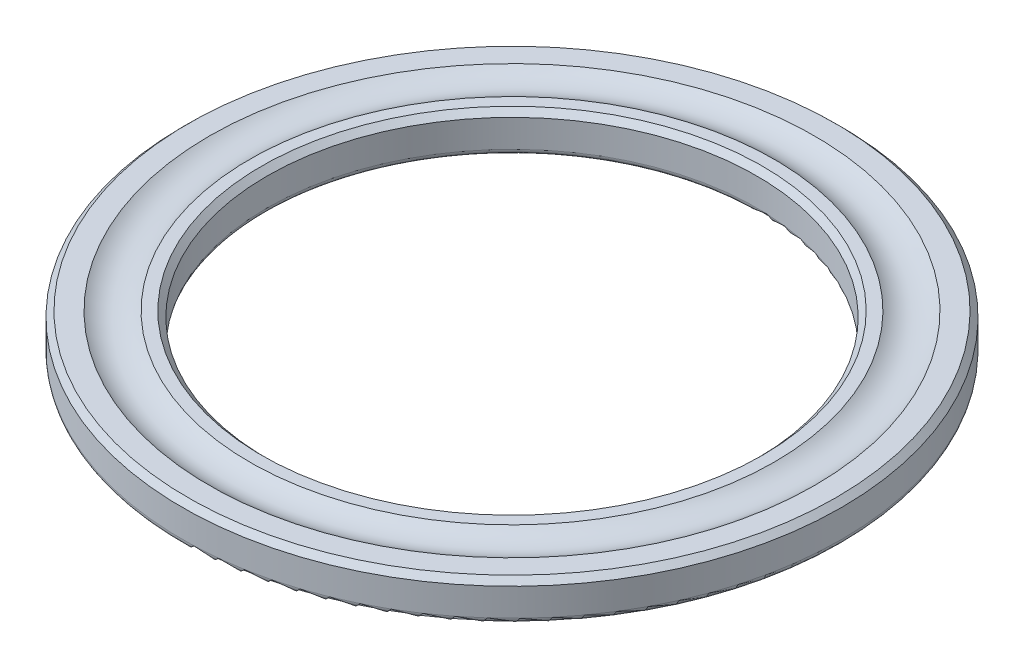
ISO-10303-21;
HEADER;
FILE_DESCRIPTION(('STEP AP214'),'2;1');
FILE_NAME('part.step','',(''),(''),'','','');
FILE_SCHEMA(('AUTOMOTIVE_DESIGN { 1 0 10303 214 1 1 1 1 }'));
ENDSEC;
DATA;
#1=APPLICATION_CONTEXT('core data for automotive mechanical design processes');
#2=APPLICATION_PROTOCOL_DEFINITION('international standard','automotive_design',2000,#1);
#3=PRODUCT_CONTEXT('',#1,'mechanical');
#4=PRODUCT('Part','Part','',(#3));
#5=PRODUCT_RELATED_PRODUCT_CATEGORY('part','',(#4));
#6=PRODUCT_DEFINITION_FORMATION('','',#4);
#7=PRODUCT_DEFINITION_CONTEXT('part definition',#1,'design');
#8=PRODUCT_DEFINITION('design','',#6,#7);
#9=PRODUCT_DEFINITION_SHAPE('','',#8);
#10=(LENGTH_UNIT() NAMED_UNIT(*) SI_UNIT(.MILLI.,.METRE.));
#11=(NAMED_UNIT(*) PLANE_ANGLE_UNIT() SI_UNIT($,.RADIAN.));
#12=(NAMED_UNIT(*) SI_UNIT($,.STERADIAN.) SOLID_ANGLE_UNIT());
#13=UNCERTAINTY_MEASURE_WITH_UNIT(LENGTH_MEASURE(1.E-05),#10,'distance_accuracy_value','');
#14=(GEOMETRIC_REPRESENTATION_CONTEXT(3) GLOBAL_UNCERTAINTY_ASSIGNED_CONTEXT((#13)) GLOBAL_UNIT_ASSIGNED_CONTEXT((#10,
#11,#12)) REPRESENTATION_CONTEXT('',''));
#15=CARTESIAN_POINT('',(0.,0.,0.));
#16=DIRECTION('',(0.,0.,1.));
#17=DIRECTION('',(1.,0.,0.));
#18=AXIS2_PLACEMENT_3D('',#15,#16,#17);
#19=CARTESIAN_POINT('',(30.5,0.,0.));
#20=DIRECTION('',(0.,-1.,0.));
#21=DIRECTION('',(-1.,0.,0.));
#22=AXIS2_PLACEMENT_3D('',#19,#20,#21);
#23=PLANE('',#22);
#24=CARTESIAN_POINT('',(0.,0.,0.));
#25=DIRECTION('',(0.,1.,0.));
#26=DIRECTION('',(1.,0.,0.));
#27=AXIS2_PLACEMENT_3D('',#24,#25,#26);
#28=CIRCLE('',#27,26.6);
#29=CARTESIAN_POINT('',(26.6,0.,0.));
#30=VERTEX_POINT('',#29);
#31=EDGE_CURVE('E10',#30,#30,#28,.T.);
#32=ORIENTED_EDGE('',*,*,#31,.T.);
#33=EDGE_LOOP('',(#32));
#34=FACE_BOUND('',#33,.T.);
#35=CARTESIAN_POINT('',(0.,0.,0.));
#36=DIRECTION('',(0.,1.,0.));
#37=DIRECTION('',(1.,0.,0.));
#38=AXIS2_PLACEMENT_3D('',#35,#36,#37);
#39=CIRCLE('',#38,34.4);
#40=CARTESIAN_POINT('',(34.4,0.,0.));
#41=VERTEX_POINT('',#40);
#42=EDGE_CURVE('E20',#41,#41,#39,.T.);
#43=ORIENTED_EDGE('',*,*,#42,.F.);
#44=EDGE_LOOP('',(#43));
#45=FACE_BOUND('',#44,.T.);
#46=ADVANCED_FACE('F16',(#34,#45),#23,.T.);
#47=CARTESIAN_POINT('',(0.,0.6,0.));
#48=DIRECTION('',(0.,1.,0.));
#49=DIRECTION('',(0.,0.,1.));
#50=AXIS2_PLACEMENT_3D('',#47,#48,#49);
#51=TOROIDAL_SURFACE('',#50,26.6,0.6);
#52=CARTESIAN_POINT('',(0.,0.6,0.));
#53=DIRECTION('',(0.,1.,0.));
#54=DIRECTION('',(1.,0.,0.));
#55=AXIS2_PLACEMENT_3D('',#52,#53,#54);
#56=CIRCLE('',#55,26.);
#57=CARTESIAN_POINT('',(26.,0.6,0.));
#58=VERTEX_POINT('',#57);
#59=EDGE_CURVE('E27',#58,#58,#56,.T.);
#60=ORIENTED_EDGE('',*,*,#59,.T.);
#61=EDGE_LOOP('',(#60));
#62=FACE_BOUND('',#61,.T.);
#63=ORIENTED_EDGE('',*,*,#31,.F.);
#64=EDGE_LOOP('',(#63));
#65=FACE_BOUND('',#64,.T.);
#66=ADVANCED_FACE('F106',(#62,#65),#51,.T.);
#67=CARTESIAN_POINT('',(0.,2.0712,0.));
#68=DIRECTION('',(0.,-1.,0.));
#69=DIRECTION('',(1.,0.,0.));
#70=AXIS2_PLACEMENT_3D('',#67,#68,#69);
#71=CYLINDRICAL_SURFACE('',#70,26.);
#72=CARTESIAN_POINT('',(0.,3.5424,0.));
#73=DIRECTION('',(0.,1.,0.));
#74=DIRECTION('',(1.,0.,0.));
#75=AXIS2_PLACEMENT_3D('',#72,#73,#74);
#76=CIRCLE('',#75,26.);
#77=CARTESIAN_POINT('',(26.,3.5424,0.));
#78=VERTEX_POINT('',#77);
#79=EDGE_CURVE('E78',#78,#78,#76,.T.);
#80=ORIENTED_EDGE('',*,*,#79,.T.);
#81=EDGE_LOOP('',(#80));
#82=FACE_BOUND('',#81,.T.);
#83=ORIENTED_EDGE('',*,*,#59,.F.);
#84=EDGE_LOOP('',(#83));
#85=FACE_BOUND('',#84,.T.);
#86=ADVANCED_FACE('F101',(#82,#85),#71,.F.);
#87=CARTESIAN_POINT('',(0.,3.8424,0.));
#88=DIRECTION('',(0.,1.,0.));
#89=DIRECTION('',(1.,0.,0.));
#90=AXIS2_PLACEMENT_3D('',#87,#88,#89);
#91=CONICAL_SURFACE('',#90,26.3,0.785398163397449);
#92=CARTESIAN_POINT('',(0.,4.1424,0.));
#93=DIRECTION('',(0.,1.,0.));
#94=DIRECTION('',(1.,0.,0.));
#95=AXIS2_PLACEMENT_3D('',#92,#93,#94);
#96=CIRCLE('',#95,26.6);
#97=CARTESIAN_POINT('',(26.6,4.1424,0.));
#98=VERTEX_POINT('',#97);
#99=EDGE_CURVE('E68',#98,#98,#96,.T.);
#100=ORIENTED_EDGE('',*,*,#99,.T.);
#101=EDGE_LOOP('',(#100));
#102=FACE_BOUND('',#101,.T.);
#103=ORIENTED_EDGE('',*,*,#79,.F.);
#104=EDGE_LOOP('',(#103));
#105=FACE_BOUND('',#104,.T.);
#106=ADVANCED_FACE('F88',(#102,#105),#91,.F.);
#107=CARTESIAN_POINT('',(27.2284,4.1424,0.));
#108=DIRECTION('',(0.,1.,0.));
#109=DIRECTION('',(1.,0.,0.));
#110=AXIS2_PLACEMENT_3D('',#107,#108,#109);
#111=PLANE('',#110);
#112=CARTESIAN_POINT('',(0.,4.1424,0.));
#113=DIRECTION('',(0.,1.,0.));
#114=DIRECTION('',(1.,0.,0.));
#115=AXIS2_PLACEMENT_3D('',#112,#113,#114);
#116=CIRCLE('',#115,27.8568);
#117=CARTESIAN_POINT('',(27.8568,4.1424,0.));
#118=VERTEX_POINT('',#117);
#119=EDGE_CURVE('E62',#118,#118,#116,.T.);
#120=ORIENTED_EDGE('',*,*,#119,.T.);
#121=EDGE_LOOP('',(#120));
#122=FACE_BOUND('',#121,.T.);
#123=ORIENTED_EDGE('',*,*,#99,.F.);
#124=EDGE_LOOP('',(#123));
#125=FACE_BOUND('',#124,.T.);
#126=ADVANCED_FACE('F91',(#122,#125),#111,.T.);
#127=CARTESIAN_POINT('',(0.,7.,0.));
#128=DIRECTION('',(0.,1.,0.));
#129=DIRECTION('',(0.,0.,1.));
#130=AXIS2_PLACEMENT_3D('',#127,#128,#129);
#131=TOROIDAL_SURFACE('',#130,30.,3.572);
#132=CARTESIAN_POINT('',(0.,4.1424,0.));
#133=DIRECTION('',(0.,1.,0.));
#134=DIRECTION('',(1.,0.,0.));
#135=AXIS2_PLACEMENT_3D('',#132,#133,#134);
#136=CIRCLE('',#135,32.1432);
#137=CARTESIAN_POINT('',(32.1432,4.1424,0.));
#138=VERTEX_POINT('',#137);
#139=EDGE_CURVE('E57',#138,#138,#136,.T.);
#140=ORIENTED_EDGE('',*,*,#139,.T.);
#141=EDGE_LOOP('',(#140));
#142=FACE_BOUND('',#141,.T.);
#143=ORIENTED_EDGE('',*,*,#119,.F.);
#144=EDGE_LOOP('',(#143));
#145=FACE_BOUND('',#144,.T.);
#146=ADVANCED_FACE('F58',(#142,#145),#131,.F.);
#147=CARTESIAN_POINT('',(33.2716,4.1424,0.));
#148=DIRECTION('',(0.,1.,0.));
#149=DIRECTION('',(1.,0.,0.));
#150=AXIS2_PLACEMENT_3D('',#147,#148,#149);
#151=PLANE('',#150);
#152=CARTESIAN_POINT('',(0.,4.1424,0.));
#153=DIRECTION('',(0.,1.,0.));
#154=DIRECTION('',(1.,0.,0.));
#155=AXIS2_PLACEMENT_3D('',#152,#153,#154);
#156=CIRCLE('',#155,34.4);
#157=CARTESIAN_POINT('',(34.4,4.1424,0.));
#158=VERTEX_POINT('',#157);
#159=EDGE_CURVE('E63',#158,#158,#156,.T.);
#160=ORIENTED_EDGE('',*,*,#159,.T.);
#161=EDGE_LOOP('',(#160));
#162=FACE_BOUND('',#161,.T.);
#163=ORIENTED_EDGE('',*,*,#139,.F.);
#164=EDGE_LOOP('',(#163));
#165=FACE_BOUND('',#164,.T.);
#166=ADVANCED_FACE('F18',(#162,#165),#151,.T.);
#167=CARTESIAN_POINT('',(0.,3.8424,0.));
#168=DIRECTION('',(0.,-1.,0.));
#169=DIRECTION('',(1.,0.,0.));
#170=AXIS2_PLACEMENT_3D('',#167,#168,#169);
#171=CONICAL_SURFACE('',#170,34.7,0.785398163397443);
#172=CARTESIAN_POINT('',(0.,3.5424,0.));
#173=DIRECTION('',(0.,1.,0.));
#174=DIRECTION('',(1.,0.,0.));
#175=AXIS2_PLACEMENT_3D('',#172,#173,#174);
#176=CIRCLE('',#175,35.);
#177=CARTESIAN_POINT('',(35.,3.5424,0.));
#178=VERTEX_POINT('',#177);
#179=EDGE_CURVE('E70',#178,#178,#176,.T.);
#180=ORIENTED_EDGE('',*,*,#179,.T.);
#181=EDGE_LOOP('',(#180));
#182=FACE_BOUND('',#181,.T.);
#183=ORIENTED_EDGE('',*,*,#159,.F.);
#184=EDGE_LOOP('',(#183));
#185=FACE_BOUND('',#184,.T.);
#186=ADVANCED_FACE('F114',(#182,#185),#171,.T.);
#187=CARTESIAN_POINT('',(0.,2.0712,0.));
#188=DIRECTION('',(0.,-1.,0.));
#189=DIRECTION('',(1.,0.,0.));
#190=AXIS2_PLACEMENT_3D('',#187,#188,#189);
#191=CYLINDRICAL_SURFACE('',#190,35.);
#192=CARTESIAN_POINT('',(0.,0.6,0.));
#193=DIRECTION('',(0.,1.,0.));
#194=DIRECTION('',(1.,0.,0.));
#195=AXIS2_PLACEMENT_3D('',#192,#193,#194);
#196=CIRCLE('',#195,35.);
#197=CARTESIAN_POINT('',(35.,0.6,0.));
#198=VERTEX_POINT('',#197);
#199=EDGE_CURVE('E74',#198,#198,#196,.T.);
#200=ORIENTED_EDGE('',*,*,#199,.T.);
#201=EDGE_LOOP('',(#200));
#202=FACE_BOUND('',#201,.T.);
#203=ORIENTED_EDGE('',*,*,#179,.F.);
#204=EDGE_LOOP('',(#203));
#205=FACE_BOUND('',#204,.T.);
#206=ADVANCED_FACE('F116',(#202,#205),#191,.T.);
#207=CARTESIAN_POINT('',(0.,0.6,0.));
#208=DIRECTION('',(0.,1.,0.));
#209=DIRECTION('',(0.,0.,1.));
#210=AXIS2_PLACEMENT_3D('',#207,#208,#209);
#211=TOROIDAL_SURFACE('',#210,34.4,0.6);
#212=ORIENTED_EDGE('',*,*,#42,.T.);
#213=EDGE_LOOP('',(#212));
#214=FACE_BOUND('',#213,.T.);
#215=ORIENTED_EDGE('',*,*,#199,.F.);
#216=EDGE_LOOP('',(#215));
#217=FACE_BOUND('',#216,.T.);
#218=ADVANCED_FACE('F122',(#214,#217),#211,.T.);
#219=CLOSED_SHELL('',(#46,#66,#86,#106,#126,#146,#166,#186,#206,#218));
#220=MANIFOLD_SOLID_BREP('B1',#219);
#221=ADVANCED_BREP_SHAPE_REPRESENTATION('',(#18,#220),#14);
#222=SHAPE_DEFINITION_REPRESENTATION(#9,#221);
ENDSEC;
END-ISO-10303-21;
